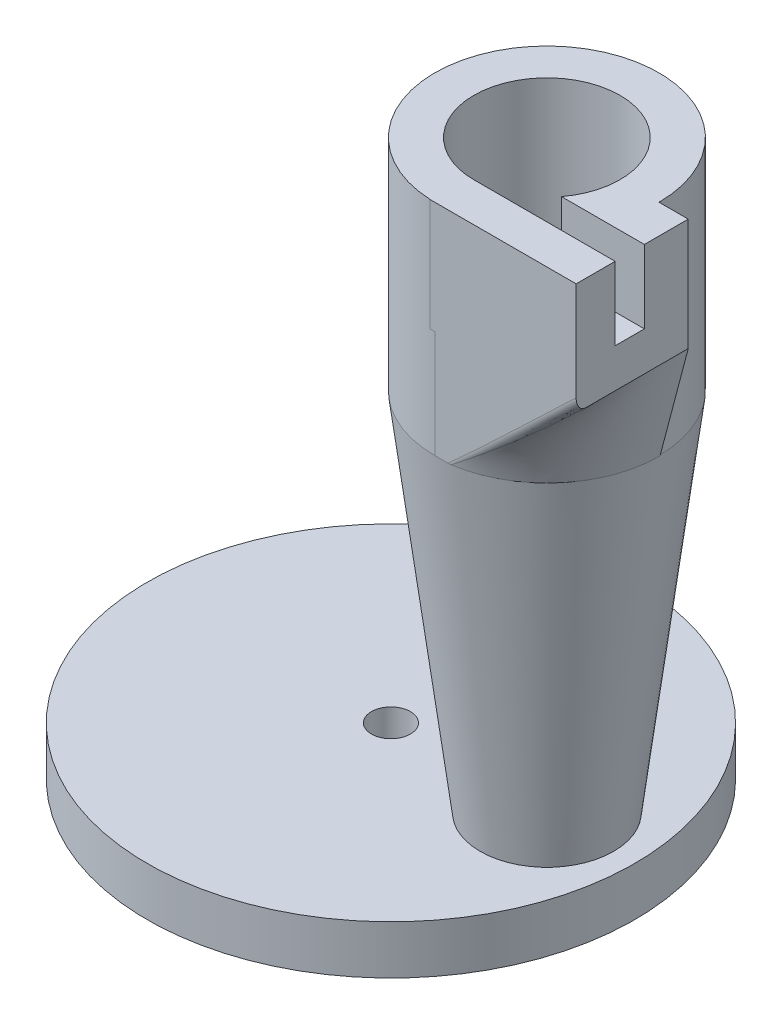
ISO-10303-21;
HEADER;
FILE_DESCRIPTION(('STEP AP214'),'2;1');
FILE_NAME('part.step','',(''),(''),'','','');
FILE_SCHEMA(('AUTOMOTIVE_DESIGN { 1 0 10303 214 1 1 1 1 }'));
ENDSEC;
DATA;
#1=APPLICATION_CONTEXT('core data for automotive mechanical design processes');
#2=APPLICATION_PROTOCOL_DEFINITION('international standard','automotive_design',2000,#1);
#3=PRODUCT_CONTEXT('',#1,'mechanical');
#4=PRODUCT('Part','Part','',(#3));
#5=PRODUCT_RELATED_PRODUCT_CATEGORY('part','',(#4));
#6=PRODUCT_DEFINITION_FORMATION('','',#4);
#7=PRODUCT_DEFINITION_CONTEXT('part definition',#1,'design');
#8=PRODUCT_DEFINITION('design','',#6,#7);
#9=PRODUCT_DEFINITION_SHAPE('','',#8);
#10=(LENGTH_UNIT() NAMED_UNIT(*) SI_UNIT(.MILLI.,.METRE.));
#11=(NAMED_UNIT(*) PLANE_ANGLE_UNIT() SI_UNIT($,.RADIAN.));
#12=(NAMED_UNIT(*) SI_UNIT($,.STERADIAN.) SOLID_ANGLE_UNIT());
#13=UNCERTAINTY_MEASURE_WITH_UNIT(LENGTH_MEASURE(1.E-05),#10,'distance_accuracy_value','');
#14=(GEOMETRIC_REPRESENTATION_CONTEXT(3) GLOBAL_UNCERTAINTY_ASSIGNED_CONTEXT((#13)) GLOBAL_UNIT_ASSIGNED_CONTEXT((#10,
#11,#12)) REPRESENTATION_CONTEXT('',''));
#15=CARTESIAN_POINT('',(0.,0.,0.));
#16=DIRECTION('',(0.,0.,1.));
#17=DIRECTION('',(1.,0.,0.));
#18=AXIS2_PLACEMENT_3D('',#15,#16,#17);
#19=CARTESIAN_POINT('',(0.,0.,0.));
#20=DIRECTION('',(0.,-1.,0.));
#21=DIRECTION('',(0.,0.,-1.));
#22=AXIS2_PLACEMENT_3D('',#19,#20,#21);
#23=CYLINDRICAL_SURFACE('',#22,11.5);
#24=CARTESIAN_POINT('',(0.,37.5,0.));
#25=DIRECTION('',(0.,-1.,0.));
#26=DIRECTION('',(0.,0.,-1.));
#27=AXIS2_PLACEMENT_3D('',#24,#25,#26);
#28=CIRCLE('',#27,11.5);
#29=CARTESIAN_POINT('',(0.,37.5,11.5));
#30=VERTEX_POINT('',#29);
#31=CARTESIAN_POINT('',(11.5,37.5,0.));
#32=VERTEX_POINT('',#31);
#33=EDGE_CURVE('E150',#30,#32,#28,.T.);
#34=ORIENTED_EDGE('',*,*,#33,.F.);
#35=DIRECTION('',(0.,-1.,0.));
#36=VECTOR('',#35,1.);
#37=CARTESIAN_POINT('',(0.,48.5,11.5));
#38=LINE('',#37,#36);
#39=CARTESIAN_POINT('',(0.,48.5,11.5));
#40=VERTEX_POINT('',#39);
#41=EDGE_CURVE('E145',#40,#30,#38,.T.);
#42=ORIENTED_EDGE('',*,*,#41,.F.);
#43=CARTESIAN_POINT('',(0.,48.5,0.));
#44=DIRECTION('',(0.,-1.,0.));
#45=DIRECTION('',(0.,0.,-1.));
#46=AXIS2_PLACEMENT_3D('',#43,#44,#45);
#47=CIRCLE('',#46,11.5);
#48=CARTESIAN_POINT('',(-0.499999999999999,48.5,11.489125293076));
#49=VERTEX_POINT('',#48);
#50=EDGE_CURVE('E147',#49,#40,#47,.F.);
#51=ORIENTED_EDGE('',*,*,#50,.F.);
#52=DIRECTION('',(0.,-1.,0.));
#53=VECTOR('',#52,1.);
#54=CARTESIAN_POINT('',(-0.499999999999999,0.,11.489125293076));
#55=LINE('',#54,#53);
#56=CARTESIAN_POINT('',(-0.499999999999999,60.,11.489125293076));
#57=VERTEX_POINT('',#56);
#58=EDGE_CURVE('E163',#57,#49,#55,.T.);
#59=ORIENTED_EDGE('',*,*,#58,.F.);
#60=CARTESIAN_POINT('',(0.,60.,0.));
#61=DIRECTION('',(0.,-1.,0.));
#62=DIRECTION('',(0.,0.,-1.));
#63=AXIS2_PLACEMENT_3D('',#60,#61,#62);
#64=CIRCLE('',#63,11.5);
#65=CARTESIAN_POINT('',(11.5,60.,0.));
#66=VERTEX_POINT('',#65);
#67=EDGE_CURVE('E283',#57,#66,#64,.T.);
#68=ORIENTED_EDGE('',*,*,#67,.T.);
#69=DIRECTION('',(0.,-1.,0.));
#70=VECTOR('',#69,1.);
#71=CARTESIAN_POINT('',(11.5,0.,0.));
#72=LINE('',#71,#70);
#73=EDGE_CURVE('E162',#32,#66,#72,.F.);
#74=ORIENTED_EDGE('',*,*,#73,.F.);
#75=EDGE_LOOP('',(#34,#42,#51,#59,#68,#74));
#76=FACE_BOUND('',#75,.T.);
#77=ADVANCED_FACE('F51',(#76),#23,.T.);
#78=CARTESIAN_POINT('',(0.,37.7472811272646,0.));
#79=DIRECTION('',(0.,1.,0.));
#80=DIRECTION('',(0.,0.,1.));
#81=AXIS2_PLACEMENT_3D('',#78,#79,#80);
#82=CONICAL_SURFACE('',#81,7.49999999999999,0.123483416160892);
#83=CARTESIAN_POINT('',(0.,0.,0.));
#84=DIRECTION('',(0.,-1.,0.));
#85=DIRECTION('',(0.,0.,-1.));
#86=AXIS2_PLACEMENT_3D('',#83,#84,#85);
#87=CIRCLE('',#86,2.815);
#88=CARTESIAN_POINT('',(0.,0.,-2.815));
#89=VERTEX_POINT('',#88);
#90=EDGE_CURVE('E291',#89,#89,#87,.T.);
#91=ORIENTED_EDGE('',*,*,#90,.T.);
#92=EDGE_LOOP('',(#91));
#93=FACE_BOUND('',#92,.T.);
#94=CARTESIAN_POINT('',(0.,37.7472811272646,0.));
#95=DIRECTION('',(0.,-1.,0.));
#96=DIRECTION('',(0.,0.,-1.));
#97=AXIS2_PLACEMENT_3D('',#94,#95,#96);
#98=CIRCLE('',#97,7.49999999999999);
#99=CARTESIAN_POINT('',(0.,37.7472811272646,-7.49999999999999));
#100=VERTEX_POINT('',#99);
#101=EDGE_CURVE('E288',#100,#100,#98,.T.);
#102=ORIENTED_EDGE('',*,*,#101,.F.);
#103=EDGE_LOOP('',(#102));
#104=FACE_BOUND('',#103,.T.);
#105=ADVANCED_FACE('F407',(#93,#104),#82,.F.);
#106=CARTESIAN_POINT('',(0.,0.,0.));
#107=DIRECTION('',(0.,-1.,0.));
#108=DIRECTION('',(0.,0.,-1.));
#109=AXIS2_PLACEMENT_3D('',#106,#107,#108);
#110=CYLINDRICAL_SURFACE('',#109,7.49999999999999);
#111=DIRECTION('',(0.,-1.,0.));
#112=VECTOR('',#111,1.);
#113=CARTESIAN_POINT('',(0.,60.,7.5));
#114=LINE('',#113,#112);
#115=CARTESIAN_POINT('',(0.,60.,7.49999999999999));
#116=VERTEX_POINT('',#115);
#117=CARTESIAN_POINT('',(0.,52.5,7.49999999999999));
#118=VERTEX_POINT('',#117);
#119=EDGE_CURVE('E246',#116,#118,#114,.T.);
#120=ORIENTED_EDGE('',*,*,#119,.T.);
#121=CARTESIAN_POINT('',(0.,52.5,0.));
#122=DIRECTION('',(0.,1.,0.));
#123=DIRECTION('',(0.,0.,1.));
#124=AXIS2_PLACEMENT_3D('',#121,#122,#123);
#125=CIRCLE('',#124,7.49999999999999);
#126=CARTESIAN_POINT('',(5.99999999999998,52.5,4.5));
#127=VERTEX_POINT('',#126);
#128=EDGE_CURVE('E241',#118,#127,#125,.T.);
#129=ORIENTED_EDGE('',*,*,#128,.T.);
#130=DIRECTION('',(0.,1.,0.));
#131=VECTOR('',#130,1.);
#132=CARTESIAN_POINT('',(5.99999999999998,41.,4.5));
#133=LINE('',#132,#131);
#134=CARTESIAN_POINT('',(5.99999999999999,60.,4.5));
#135=VERTEX_POINT('',#134);
#136=EDGE_CURVE('E243',#127,#135,#133,.T.);
#137=ORIENTED_EDGE('',*,*,#136,.T.);
#138=CARTESIAN_POINT('',(0.,60.,0.));
#139=DIRECTION('',(0.,-1.,0.));
#140=DIRECTION('',(0.,0.,-1.));
#141=AXIS2_PLACEMENT_3D('',#138,#139,#140);
#142=CIRCLE('',#141,7.49999999999999);
#143=EDGE_CURVE('E285',#116,#135,#142,.T.);
#144=ORIENTED_EDGE('',*,*,#143,.F.);
#145=EDGE_LOOP('',(#120,#129,#137,#144));
#146=FACE_BOUND('',#145,.T.);
#147=ORIENTED_EDGE('',*,*,#101,.T.);
#148=EDGE_LOOP('',(#147));
#149=FACE_BOUND('',#148,.T.);
#150=ADVANCED_FACE('F410',(#146,#149),#110,.F.);
#151=CARTESIAN_POINT('',(7.49999999999999,60.,0.));
#152=DIRECTION('',(0.,1.,0.));
#153=DIRECTION('',(0.,0.,1.));
#154=AXIS2_PLACEMENT_3D('',#151,#152,#153);
#155=PLANE('',#154);
#156=ORIENTED_EDGE('',*,*,#143,.T.);
#157=DIRECTION('',(1.,0.,0.));
#158=VECTOR('',#157,1.);
#159=CARTESIAN_POINT('',(-0.499999999999999,60.,4.5));
#160=LINE('',#159,#158);
#161=CARTESIAN_POINT('',(14.5,60.,4.5));
#162=VERTEX_POINT('',#161);
#163=EDGE_CURVE('E173',#135,#162,#160,.T.);
#164=ORIENTED_EDGE('',*,*,#163,.T.);
#165=DIRECTION('',(0.,0.,1.));
#166=VECTOR('',#165,1.);
#167=CARTESIAN_POINT('',(14.5,60.,4.5));
#168=LINE('',#167,#166);
#169=CARTESIAN_POINT('',(14.5,60.,0.));
#170=VERTEX_POINT('',#169);
#171=EDGE_CURVE('E258',#170,#162,#168,.T.);
#172=ORIENTED_EDGE('',*,*,#171,.F.);
#173=DIRECTION('',(1.,0.,0.));
#174=VECTOR('',#173,1.);
#175=CARTESIAN_POINT('',(-0.499999999999999,60.,0.));
#176=LINE('',#175,#174);
#177=EDGE_CURVE('E170',#66,#170,#176,.T.);
#178=ORIENTED_EDGE('',*,*,#177,.F.);
#179=ORIENTED_EDGE('',*,*,#67,.F.);
#180=DIRECTION('',(0.,0.,1.));
#181=VECTOR('',#180,1.);
#182=CARTESIAN_POINT('',(-0.499999999999999,60.,11.5));
#183=LINE('',#182,#181);
#184=CARTESIAN_POINT('',(-0.499999999999999,60.,11.5));
#185=VERTEX_POINT('',#184);
#186=EDGE_CURVE('E250',#57,#185,#183,.T.);
#187=ORIENTED_EDGE('',*,*,#186,.T.);
#188=DIRECTION('',(1.,0.,0.));
#189=VECTOR('',#188,1.);
#190=CARTESIAN_POINT('',(-0.499999999999999,60.,11.5));
#191=LINE('',#190,#189);
#192=CARTESIAN_POINT('',(14.5,60.,11.5));
#193=VERTEX_POINT('',#192);
#194=EDGE_CURVE('E171',#185,#193,#191,.T.);
#195=ORIENTED_EDGE('',*,*,#194,.T.);
#196=DIRECTION('',(0.,0.,1.));
#197=VECTOR('',#196,1.);
#198=CARTESIAN_POINT('',(14.5,60.,11.5));
#199=LINE('',#198,#197);
#200=CARTESIAN_POINT('',(14.5,60.,7.5));
#201=VERTEX_POINT('',#200);
#202=EDGE_CURVE('E249',#201,#193,#199,.T.);
#203=ORIENTED_EDGE('',*,*,#202,.F.);
#204=DIRECTION('',(1.,0.,0.));
#205=VECTOR('',#204,1.);
#206=CARTESIAN_POINT('',(-0.499999999999999,60.,7.5));
#207=LINE('',#206,#205);
#208=EDGE_CURVE('E270',#116,#201,#207,.T.);
#209=ORIENTED_EDGE('',*,*,#208,.F.);
#210=EDGE_LOOP('',(#156,#164,#172,#178,#179,#187,#195,#203,#209));
#211=FACE_BOUND('',#210,.T.);
#212=ADVANCED_FACE('F315',(#211),#155,.T.);
#213=CARTESIAN_POINT('',(0.,0.,0.));
#214=DIRECTION('',(0.,1.,0.));
#215=DIRECTION('',(0.,0.,1.));
#216=AXIS2_PLACEMENT_3D('',#213,#214,#215);
#217=CONICAL_SURFACE('',#216,6.84569127223571,0.123483416160892);
#218=CARTESIAN_POINT('',(0.,37.5,0.));
#219=DIRECTION('',(0.,-1.,0.));
#220=DIRECTION('',(1.,0.,0.));
#221=AXIS2_PLACEMENT_3D('',#218,#219,#220);
#222=CIRCLE('',#221,11.5);
#223=CARTESIAN_POINT('',(0.0238940979477491,37.5,11.4999875801416));
#224=VERTEX_POINT('',#223);
#225=EDGE_CURVE('E286',#32,#224,#222,.T.);
#226=ORIENTED_EDGE('',*,*,#225,.T.);
#227=CARTESIAN_POINT('',(0.,37.5,0.));
#228=DIRECTION('',(0.,-1.,0.));
#229=DIRECTION('',(0.,0.,-1.));
#230=AXIS2_PLACEMENT_3D('',#227,#228,#229);
#231=CIRCLE('',#230,11.5);
#232=EDGE_CURVE('E153',#224,#30,#231,.T.);
#233=ORIENTED_EDGE('',*,*,#232,.T.);
#234=ORIENTED_EDGE('',*,*,#33,.T.);
#235=EDGE_LOOP('',(#226,#233,#234));
#236=FACE_BOUND('',#235,.T.);
#237=CARTESIAN_POINT('',(0.,0.,0.));
#238=DIRECTION('',(0.,-1.,0.));
#239=DIRECTION('',(0.,0.,-1.));
#240=AXIS2_PLACEMENT_3D('',#237,#238,#239);
#241=CIRCLE('',#240,6.84569127223571);
#242=CARTESIAN_POINT('',(0.,0.,-6.84569127223571));
#243=VERTEX_POINT('',#242);
#244=EDGE_CURVE('E280',#243,#243,#241,.T.);
#245=ORIENTED_EDGE('',*,*,#244,.F.);
#246=EDGE_LOOP('',(#245));
#247=FACE_BOUND('',#246,.T.);
#248=ADVANCED_FACE('F304',(#236,#247),#217,.T.);
#249=CARTESIAN_POINT('',(6.84569127223571,0.,0.));
#250=DIRECTION('',(0.,1.,0.));
#251=DIRECTION('',(0.,0.,1.));
#252=AXIS2_PLACEMENT_3D('',#249,#250,#251);
#253=PLANE('',#252);
#254=ORIENTED_EDGE('',*,*,#244,.T.);
#255=EDGE_LOOP('',(#254));
#256=FACE_BOUND('',#255,.T.);
#257=CARTESIAN_POINT('',(-16.,0.,0.));
#258=DIRECTION('',(0.,-1.,0.));
#259=DIRECTION('',(0.,0.,-1.));
#260=AXIS2_PLACEMENT_3D('',#257,#258,#259);
#261=CIRCLE('',#260,2.);
#262=CARTESIAN_POINT('',(-16.,0.,-2.));
#263=VERTEX_POINT('',#262);
#264=EDGE_CURVE('E604',#263,#263,#261,.T.);
#265=ORIENTED_EDGE('',*,*,#264,.T.);
#266=EDGE_LOOP('',(#265));
#267=FACE_BOUND('',#266,.T.);
#268=CARTESIAN_POINT('',(-16.,0.,0.));
#269=DIRECTION('',(0.,-1.,0.));
#270=DIRECTION('',(0.,0.,-1.));
#271=AXIS2_PLACEMENT_3D('',#268,#269,#270);
#272=CIRCLE('',#271,25.);
#273=CARTESIAN_POINT('',(-16.,0.,-25.));
#274=VERTEX_POINT('',#273);
#275=EDGE_CURVE('E607',#274,#274,#272,.T.);
#276=ORIENTED_EDGE('',*,*,#275,.F.);
#277=EDGE_LOOP('',(#276));
#278=FACE_BOUND('',#277,.T.);
#279=ADVANCED_FACE('F314',(#256,#267,#278),#253,.T.);
#280=CARTESIAN_POINT('',(2.815,-5.,0.));
#281=DIRECTION('',(0.,-1.,0.));
#282=DIRECTION('',(0.,0.,-1.));
#283=AXIS2_PLACEMENT_3D('',#280,#281,#282);
#284=PLANE('',#283);
#285=CARTESIAN_POINT('',(0.,-5.,0.));
#286=DIRECTION('',(0.,-1.,0.));
#287=DIRECTION('',(0.,0.,-1.));
#288=AXIS2_PLACEMENT_3D('',#285,#286,#287);
#289=CIRCLE('',#288,2.815);
#290=CARTESIAN_POINT('',(0.,-5.,-2.815));
#291=VERTEX_POINT('',#290);
#292=EDGE_CURVE('E272',#291,#291,#289,.T.);
#293=ORIENTED_EDGE('',*,*,#292,.F.);
#294=EDGE_LOOP('',(#293));
#295=FACE_BOUND('',#294,.T.);
#296=CARTESIAN_POINT('',(-16.,-5.,0.));
#297=DIRECTION('',(0.,-1.,0.));
#298=DIRECTION('',(0.,0.,-1.));
#299=AXIS2_PLACEMENT_3D('',#296,#297,#298);
#300=CIRCLE('',#299,2.);
#301=CARTESIAN_POINT('',(-16.,-5.,-2.));
#302=VERTEX_POINT('',#301);
#303=EDGE_CURVE('E614',#302,#302,#300,.T.);
#304=ORIENTED_EDGE('',*,*,#303,.F.);
#305=EDGE_LOOP('',(#304));
#306=FACE_BOUND('',#305,.T.);
#307=CARTESIAN_POINT('',(-16.,-5.,0.));
#308=DIRECTION('',(0.,-1.,0.));
#309=DIRECTION('',(0.,0.,-1.));
#310=AXIS2_PLACEMENT_3D('',#307,#308,#309);
#311=CIRCLE('',#310,25.);
#312=CARTESIAN_POINT('',(-16.,-5.,-25.));
#313=VERTEX_POINT('',#312);
#314=EDGE_CURVE('E608',#313,#313,#311,.T.);
#315=ORIENTED_EDGE('',*,*,#314,.T.);
#316=EDGE_LOOP('',(#315));
#317=FACE_BOUND('',#316,.T.);
#318=ADVANCED_FACE('F515',(#295,#306,#317),#284,.T.);
#319=CARTESIAN_POINT('',(0.,0.,0.));
#320=DIRECTION('',(0.,-1.,0.));
#321=DIRECTION('',(0.,0.,-1.));
#322=AXIS2_PLACEMENT_3D('',#319,#320,#321);
#323=CYLINDRICAL_SURFACE('',#322,2.815);
#324=ORIENTED_EDGE('',*,*,#292,.T.);
#325=EDGE_LOOP('',(#324));
#326=FACE_BOUND('',#325,.T.);
#327=ORIENTED_EDGE('',*,*,#90,.F.);
#328=EDGE_LOOP('',(#327));
#329=FACE_BOUND('',#328,.T.);
#330=ADVANCED_FACE('F354',(#326,#329),#323,.F.);
#331=CARTESIAN_POINT('',(14.5,0.,0.));
#332=DIRECTION('',(-1.,0.,0.));
#333=DIRECTION('',(0.,0.,1.));
#334=AXIS2_PLACEMENT_3D('',#331,#332,#333);
#335=PLANE('',#334);
#336=DIRECTION('',(0.,-1.,0.));
#337=VECTOR('',#336,1.);
#338=CARTESIAN_POINT('',(14.5,60.,11.5));
#339=LINE('',#338,#337);
#340=CARTESIAN_POINT('',(14.5,49.8741831116433,11.5));
#341=VERTEX_POINT('',#340);
#342=EDGE_CURVE('E257',#193,#341,#339,.T.);
#343=ORIENTED_EDGE('',*,*,#342,.T.);
#344=CARTESIAN_POINT('',(18.3270982272595,53.4324744484125,11.5));
#345=CARTESIAN_POINT('',(19.2174719535008,52.4637158000148,11.5));
#346=CARTESIAN_POINT('',(18.9790860664938,52.7230882218279,10.2322631160588));
#347=CARTESIAN_POINT('',(17.9485732377409,53.0845864068516,11.5));
#348=CARTESIAN_POINT('',(18.8287535822594,52.1370380926104,11.5));
#349=CARTESIAN_POINT('',(18.6043319630364,52.3726392818946,10.248329326022));
#350=CARTESIAN_POINT('',(17.5706243942171,52.736071141079,11.5));
#351=CARTESIAN_POINT('',(18.4363937672007,51.8074147302744,11.5));
#352=CARTESIAN_POINT('',(18.2301751372626,52.0216168215836,10.2656755683862));
#353=CARTESIAN_POINT('',(16.8159215193194,52.0377582818663,11.5));
#354=CARTESIAN_POINT('',(17.6502991872931,51.1471037188842,11.5));
#355=CARTESIAN_POINT('',(17.4827644081412,51.3187007565604,10.3033676775976));
#356=CARTESIAN_POINT('',(16.4391674739088,51.687960703596,11.5));
#357=CARTESIAN_POINT('',(17.2577291042656,50.8173922635779,11.5));
#358=CARTESIAN_POINT('',(17.1095104941983,50.9668071621695,10.3237135090706));
#359=CARTESIAN_POINT('',(15.6868876221408,50.9870469839543,11.5));
#360=CARTESIAN_POINT('',(16.4712703883977,50.1568208382619,11.5));
#361=CARTESIAN_POINT('',(16.3636049686257,50.2624162936681,10.3678447239822));
#362=CARTESIAN_POINT('',(15.3113618163198,50.6359308420072,11.5));
#363=CARTESIAN_POINT('',(16.0785849767215,49.8269725337902,11.5));
#364=CARTESIAN_POINT('',(15.9909533572589,49.909919019294,10.3916301089229));
#365=CARTESIAN_POINT('',(14.5614972869269,49.9324243411901,11.5));
#366=CARTESIAN_POINT('',(15.2919795915709,49.1659792341524,11.5));
#367=CARTESIAN_POINT('',(15.2456376194724,49.2048655085766,10.4429379510206));
#368=CARTESIAN_POINT('',(14.1871585774064,49.5800339673419,11.5));
#369=CARTESIAN_POINT('',(14.8992009099565,48.8358003251393,11.5));
#370=CARTESIAN_POINT('',(14.8729734929569,48.8523092715872,10.4704604522457));
#371=CARTESIAN_POINT('',(13.8133971829128,49.2270327162744,11.5));
#372=CARTESIAN_POINT('',(14.5000000028737,48.5000000017409,11.5));
#373=CARTESIAN_POINT('',(14.500000002388,48.5000000022552,10.4999999998099));
#374=CARTESIAN_POINT('',(13.6737306043982,49.0951328761242,11.5));
#375=CARTESIAN_POINT('',(14.353850889853,48.377057633239,11.5));
#376=CARTESIAN_POINT('',(14.3606165215545,48.3683679764672,10.5110240001007));
#377=CARTESIAN_POINT('',(13.5341412736851,48.9631512770181,11.5));
#378=CARTESIAN_POINT('',(14.2069203686341,48.2534258639735,11.5));
#379=CARTESIAN_POINT('',(14.2211789753236,48.2367801599068,10.5223186212777));
#380=CARTESIAN_POINT('',(13.255109460256,48.6990342718918,11.5));
#381=CARTESIAN_POINT('',(13.9130175820364,48.0060492456747,11.5));
#382=CARTESIAN_POINT('',(13.9421445237087,47.9737399924448,10.54544281812));
#383=CARTESIAN_POINT('',(13.1156669768406,48.5668988666104,11.5));
#384=CARTESIAN_POINT('',(13.7660937423688,47.8823460186685,11.5));
#385=CARTESIAN_POINT('',(13.8025476190904,47.8422876408981,10.5572723912256));
#386=CARTESIAN_POINT('',(12.5335587309871,48.0147179446237,11.5));
#387=CARTESIAN_POINT('',(13.1597522603929,47.3716496891484,11.5));
#388=CARTESIAN_POINT('',(13.219063961376,47.29364162619,10.6077840807635));
#389=CARTESIAN_POINT('',(12.0915196175837,47.5940117156206,11.5));
#390=CARTESIAN_POINT('',(12.6934331597229,46.9784587728197,11.5));
#391=CARTESIAN_POINT('',(12.7742139443098,46.8772718296425,10.6488696859057));
#392=CARTESIAN_POINT('',(11.2083947498972,46.7515993557183,11.5));
#393=CARTESIAN_POINT('',(11.7598515275345,46.1900825816809,11.5));
#394=CARTESIAN_POINT('',(11.8804537495736,46.0481155993419,10.7353284794654));
#395=CARTESIAN_POINT('',(10.7673089973432,46.3298932230085,11.5));
#396=CARTESIAN_POINT('',(11.2933404232107,45.7955737519943,11.5));
#397=CARTESIAN_POINT('',(11.4315435645473,45.6353291720837,10.7807016756525));
#398=CARTESIAN_POINT('',(9.88545475237936,45.486142918253,11.5));
#399=CARTESIAN_POINT('',(10.3602630454294,45.0053022819841,11.5));
#400=CARTESIAN_POINT('',(10.5277997099772,44.8151242770154,10.8735412964738));
#401=CARTESIAN_POINT('',(9.44468626244665,45.0640987436212,11.5));
#402=CARTESIAN_POINT('',(9.89356605965432,44.6094697226544,11.5));
#403=CARTESIAN_POINT('',(10.0729659947012,44.4077058506975,10.9210077372755));
#404=CARTESIAN_POINT('',(8.56270491077817,44.2204753854143,11.5));
#405=CARTESIAN_POINT('',(8.96101710909828,43.8176405762782,11.5));
#406=CARTESIAN_POINT('',(9.15616902949068,43.5995797954773,11.0148747843121));
#407=CARTESIAN_POINT('',(8.12149204963126,43.7988962012247,11.5));
#408=CARTESIAN_POINT('',(8.49410361338759,43.4207699694703,11.5));
#409=CARTESIAN_POINT('',(8.69420578899248,43.1988721576945,11.0612753919575));
#410=CARTESIAN_POINT('',(7.37664451867989,43.0892692357515,11.5));
#411=CARTESIAN_POINT('',(7.70504484644918,42.7498011198065,11.5));
#412=CARTESIAN_POINT('',(7.90939377250021,42.5293130075853,11.1356755776042));
#413=CARTESIAN_POINT('',(7.0733351262827,42.800880255591,11.5));
#414=CARTESIAN_POINT('',(7.38509801912298,42.4776632539201,11.5));
#415=CARTESIAN_POINT('',(7.58843568381249,42.2585865976086,11.164876393315));
#416=CARTESIAN_POINT('',(6.46591385716449,42.2249488333212,11.5));
#417=CARTESIAN_POINT('',(6.74590085313783,41.9340064965397,11.5));
#418=CARTESIAN_POINT('',(6.94352676777599,41.7202520257326,11.2201618499068));
#419=CARTESIAN_POINT('',(6.16180198118371,41.9374063904316,11.5));
#420=CARTESIAN_POINT('',(6.42593409520581,41.6618778409765,11.5));
#421=CARTESIAN_POINT('',(6.6195759431871,41.4526438609582,11.2462464936611));
#422=CARTESIAN_POINT('',(5.55259474096442,41.3633710057339,11.5));
#423=CARTESIAN_POINT('',(5.78674806062582,41.1184213193046,11.5));
#424=CARTESIAN_POINT('',(5.96926731351504,40.9201092012276,11.2945695543227));
#425=CARTESIAN_POINT('',(5.24749938675842,41.0768780532831,11.5));
#426=CARTESIAN_POINT('',(5.4667456444207,40.8464253747716,11.5));
#427=CARTESIAN_POINT('',(5.6429095329419,40.6551826790293,11.3168080103395));
#428=CARTESIAN_POINT('',(4.6361959969529,40.5050820915786,11.5));
#429=CARTESIAN_POINT('',(4.82750770570709,40.3033291159992,11.5));
#430=CARTESIAN_POINT('',(4.98852135829338,40.1273772881502,11.3570650334445));
#431=CARTESIAN_POINT('',(4.3299879621724,40.2197790814493,11.5));
#432=CARTESIAN_POINT('',(4.50748081630961,40.0315538095041,11.5));
#433=CARTESIAN_POINT('',(4.66049096544912,39.8644984179625,11.3750836036383));
#434=CARTESIAN_POINT('',(3.6117156457527,39.5533235262208,11.5));
#435=CARTESIAN_POINT('',(3.76022614711992,39.3972715103461,11.5));
#436=CARTESIAN_POINT('',(3.8914630984269,39.2505970218283,11.4123063675243));
#437=CARTESIAN_POINT('',(3.19917919964927,39.1726794786149,11.5));
#438=CARTESIAN_POINT('',(3.33066500054193,39.0328841598022,11.5));
#439=CARTESIAN_POINT('',(3.45010759755949,38.9001018234377,11.4298176322799));
#440=CARTESIAN_POINT('',(2.5787798293171,38.6034444088422,11.5));
#441=CARTESIAN_POINT('',(2.68640527454811,38.4866586676605,11.5));
#442=CARTESIAN_POINT('',(2.78805898271722,38.3749003149558,11.4510162622407));
#443=CARTESIAN_POINT('',(2.37171207484723,38.4139859072229,11.5));
#444=CARTESIAN_POINT('',(2.4719618740775,38.3048933196422,11.5));
#445=CARTESIAN_POINT('',(2.56737123507352,38.1999215273516,11.4572377997176));
#446=CARTESIAN_POINT('',(1.95706419325688,38.0356303989013,11.5));
#447=CARTESIAN_POINT('',(2.04323901407566,37.9415766421885,11.5));
#448=CARTESIAN_POINT('',(2.12612961492012,37.8499850657346,11.4681733575765));
#449=CARTESIAN_POINT('',(1.7494840661255,37.8467333922111,11.5));
#450=CARTESIAN_POINT('',(1.82879230902504,37.7598833736586,11.5));
#451=CARTESIAN_POINT('',(1.90557574241327,37.6750273917222,11.4728873779263));
#452=CARTESIAN_POINT('',(1.54165664215917,37.658108708473,11.5));
#453=CARTESIAN_POINT('',(1.61424407236263,37.5781321729464,11.5));
#454=CARTESIAN_POINT('',(1.68515753861513,37.5000000040962,11.4769386523983));
#455=CARTESIAN_POINT('',(1.32160362141298,37.4583850702252,11.5));
#456=CARTESIAN_POINT('',(1.38750974755392,37.3860581322469,11.5));
#457=CARTESIAN_POINT('',(1.45176053642619,37.3146860331439,11.4812286889971));
#458=CARTESIAN_POINT('',(1.10127384762593,37.2589668104027,11.5));
#459=CARTESIAN_POINT('',(1.16049825571542,37.1937802441257,11.5));
#460=CARTESIAN_POINT('',(1.21851613506386,37.1292934012025,11.4847782395444));
#461=CARTESIAN_POINT('',(0.66009568606511,36.8607050129652,11.5));
#462=CARTESIAN_POINT('',(0.70662522829856,36.8093941023395,11.5));
#463=CARTESIAN_POINT('',(0.752397350908737,36.7582546201424,11.4906229532754));
#464=CARTESIAN_POINT('',(0.439247298589943,36.6618614750195,11.5));
#465=CARTESIAN_POINT('',(0.479619658018664,36.6171638027133,11.5));
#466=CARTESIAN_POINT('',(0.519522967903034,36.5726084711696,11.4929181171812));
#467=CARTESIAN_POINT('',(-0.243545379667377,36.0486050894537,11.5));
#468=CARTESIAN_POINT('',(-0.220822991258621,36.0240591641345,11.5));
#469=CARTESIAN_POINT('',(-0.198991187757134,35.998737743079,11.4984191914109));
#470=CARTESIAN_POINT('',(-0.70630298687488,35.6350971154914,11.5));
#471=CARTESIAN_POINT('',(-0.695086615594047,35.6225243790514,11.4999999999999));
#472=CARTESIAN_POINT('',(-0.683900674833865,35.6099251171122,11.4998978955063));
#473=CARTESIAN_POINT('',(-1.18624592398008,35.2080781218649,11.5));
#474=CARTESIAN_POINT('',(-1.18553674248696,35.2072806816501,11.5));
#475=CARTESIAN_POINT('',(-1.18482733230893,35.206483472996,11.4999982688376));
#476=CARTESIAN_POINT('',(-1.20254986809987,35.1935742351721,11.5));
#477=CARTESIAN_POINT('',(-1.20219593751093,35.1931760294733,11.5));
#478=CARTESIAN_POINT('',(-1.20184173242901,35.1927780966059,11.4999999699422));
#479=CARTESIAN_POINT('',(-1.21885489581604,35.1790715697716,11.5));
#480=CARTESIAN_POINT('',(-1.21885489581604,35.1790715697716,11.5));
#481=CARTESIAN_POINT('',(-1.21885489581734,35.1790715697616,11.5));
#482=(BOUNDED_SURFACE() B_SPLINE_SURFACE(3,2,((#344,#345,#346),(#347,#348,#349),(#350,#351,
#352),(#353,#354,#355),(#356,#357,#358),(#359,#360,#361),(#362,#363,#364),(#365,#366,#367),
(#368,#369,#370),(#371,#372,#373),(#374,#375,#376),(#377,#378,#379),(#380,#381,#382),(#383,#384,
#385),(#386,#387,#388),(#389,#390,#391),(#392,#393,#394),(#395,#396,#397),(#398,#399,#400),
(#401,#402,#403),(#404,#405,#406),(#407,#408,#409),(#410,#411,#412),(#413,#414,#415),(#416,#417,
#418),(#419,#420,#421),(#422,#423,#424),(#425,#426,#427),(#428,#429,#430),(#431,#432,#433),
(#434,#435,#436),(#437,#438,#439),(#440,#441,#442),(#443,#444,#445),(#446,#447,#448),(#449,#450,
#451),(#452,#453,#454),(#455,#456,#457),(#458,#459,#460),(#461,#462,#463),(#464,#465,#466),
(#467,#468,#469),(#470,#471,#472),(#473,#474,#475),(#476,#477,#478),(#479,#480,#481)),
.UNSPECIFIED.,.F.,.F.,.F.) B_SPLINE_SURFACE_WITH_KNOTS((4,2,2,2,3,2,2,2,2,2,2,2,2,2,2,2,2,3,2,2,
2,4),(3,3),(0.,1.54232430366937,3.08463042012848,4.62693721014515,6.16926218869366,
6.74557703409276,7.32188912229001,9.15260487774271,10.9833239507526,12.8140571660982,
14.6447879585813,15.9003675243842,17.1559459324137,18.4115115724906,19.6670762885436,
21.3510157111007,22.1930030900874,23.0349904869745,23.9265140771489,24.8180371541428,
26.6798018632652,26.7452666007468),(0.,1.),
.UNSPECIFIED.) GEOMETRIC_REPRESENTATION_ITEM() RATIONAL_B_SPLINE_SURFACE(((1.,0.605088058078654,
1.),(1.,0.611721858316845,1.),(1.,0.618783484443874,1.),(1.,0.63383107955852,1.),(1.,
0.64181703764523,1.),(1.,0.658782144675186,1.),(1.,0.667761294052177,1.),(1.,0.686700982991269,
1.),(1.,0.696661534125724,1.),(1.,0.707106781119328,1.),(1.,0.711004262357841,1.),(1.,
0.71496530412546,1.),(1.,0.723005988841426,1.),(1.,0.72708563122227,1.),(1.,0.744354646510324,
1.),(1.,0.758044554222607,1.),(1.,0.786040341554804,1.),(1.,0.800346222290915,1.),(1.,
0.828838534348845,1.),(1.,0.843024964747061,1.),(1.,0.870416753429098,1.),(1.,0.883622113011283,
1.),(1.,0.904383789168844,1.),(1.,0.912411473460615,1.),(1.,0.927435868907959,1.),(1.,
0.934432581014189,1.),(1.,0.947273041015835,1.),(1.,0.953116800634999,1.),(1.,0.963618195076255,
1.),(1.,0.968275830771263,1.),(1.,0.977846521274128,1.),(1.,0.982304550870365,1.),(1.,
0.987679631434713,1.),(1.,0.989252673938936,1.),(1.,0.992012365701833,1.),(1.,0.993199014952294,
1.),(1.,0.99421794700267,1.),(1.,0.995296457760616,1.),(1.,0.996187507618104,1.),(1.,
0.99765330669489,1.),(1.,0.998228056096257,1.),(1.,0.99960515915253,1.),(1.,0.999974486479388,
1.),(1.,0.999999566765393,1.),(1.,0.999999992013914,1.),(1.,1.,1.))) REPRESENTATION_ITEM('') SURFACE());
#483=CARTESIAN_POINT('',(14.5,49.8741831116433,11.5));
#484=CARTESIAN_POINT('',(14.5,49.8321469977499,11.4999951784257));
#485=CARTESIAN_POINT('',(14.5,49.7901250901346,11.4985934217812));
#486=CARTESIAN_POINT('',(14.5,49.7062535876665,11.4929667901973));
#487=CARTESIAN_POINT('',(14.5,49.6644040717401,11.4887407414621));
#488=CARTESIAN_POINT('',(14.5,49.5388359775679,11.4717098296506));
#489=CARTESIAN_POINT('',(14.5,49.4556538169973,11.4545512659098));
#490=CARTESIAN_POINT('',(14.5,49.2961556405591,11.4091723554356));
#491=CARTESIAN_POINT('',(14.5,49.2196980176397,11.3814501666099));
#492=CARTESIAN_POINT('',(14.5,49.0721772194974,11.3143098691001));
#493=CARTESIAN_POINT('',(14.5,49.0011006437483,11.2749221009649));
#494=CARTESIAN_POINT('',(14.5,48.8851586750336,11.1957961360376));
#495=CARTESIAN_POINT('',(14.5,48.8383414516413,11.1589219536486));
#496=CARTESIAN_POINT('',(14.5,48.7510404348553,11.0782591115672));
#497=CARTESIAN_POINT('',(14.5,48.7105498530936,11.0344779657426));
#498=CARTESIAN_POINT('',(14.5,48.645542542005,10.9497800597474));
#499=CARTESIAN_POINT('',(14.5,48.6194514252581,10.9100768207831));
#500=CARTESIAN_POINT('',(14.5,48.5741573141641,10.8269740523501));
#501=CARTESIAN_POINT('',(14.5,48.5549386112346,10.7835832366278));
#502=CARTESIAN_POINT('',(14.5,48.5268443963474,10.7005155721973));
#503=CARTESIAN_POINT('',(14.5,48.516872566421,10.6612136602548));
#504=CARTESIAN_POINT('',(14.5,48.5067993004118,10.6013458923974));
#505=CARTESIAN_POINT('',(14.5,48.5042553990106,10.5811701994244));
#506=CARTESIAN_POINT('',(14.5,48.500853836566,10.5406660706093));
#507=CARTESIAN_POINT('',(14.5,48.4999971192865,10.5203375556608));
#508=CARTESIAN_POINT('',(14.5,48.5,10.5));
#509=B_SPLINE_CURVE_WITH_KNOTS('',3,(#483,#484,#485,#486,#487,#488,#489,#490,#491,#492,#493,
#494,#495,#496,#497,#498,#499,#500,#501,#502,#503,#504,#505,#506,#507,#508),.UNSPECIFIED.,.F.,
.F.,(4,2,2,2,2,2,2,2,2,2,2,2,4),(0.,0.126055688431547,0.252163799109594,0.50603441530343,
0.749175579702634,0.991689839437742,1.16987906561511,1.34787576533612,1.48984898860051,
1.63149559116087,1.75258476181469,1.81352803325952,1.87450538500787),.UNSPECIFIED.);
#510=CARTESIAN_POINT('',(14.5,48.5,10.5));
#511=VERTEX_POINT('',#510);
#512=EDGE_CURVE('E12',#341,#511,#509,.T.);
#513=ORIENTED_EDGE('',*,*,#512,.T.);
#514=DIRECTION('',(0.,0.,1.));
#515=VECTOR('',#514,1.);
#516=CARTESIAN_POINT('',(14.5,48.5,0.));
#517=LINE('',#516,#515);
#518=CARTESIAN_POINT('',(14.5,48.5,0.));
#519=VERTEX_POINT('',#518);
#520=EDGE_CURVE('E336',#511,#519,#517,.F.);
#521=ORIENTED_EDGE('',*,*,#520,.T.);
#522=DIRECTION('',(0.,1.,0.));
#523=VECTOR('',#522,1.);
#524=CARTESIAN_POINT('',(14.5,48.5,0.));
#525=LINE('',#524,#523);
#526=EDGE_CURVE('E262',#519,#170,#525,.T.);
#527=ORIENTED_EDGE('',*,*,#526,.T.);
#528=ORIENTED_EDGE('',*,*,#171,.T.);
#529=DIRECTION('',(0.,-1.,0.));
#530=VECTOR('',#529,1.);
#531=CARTESIAN_POINT('',(14.5,52.5,4.5));
#532=LINE('',#531,#530);
#533=CARTESIAN_POINT('',(14.5,52.5,4.5));
#534=VERTEX_POINT('',#533);
#535=EDGE_CURVE('E261',#162,#534,#532,.T.);
#536=ORIENTED_EDGE('',*,*,#535,.T.);
#537=DIRECTION('',(0.,0.,1.));
#538=VECTOR('',#537,1.);
#539=CARTESIAN_POINT('',(14.5,52.5,7.5));
#540=LINE('',#539,#538);
#541=CARTESIAN_POINT('',(14.5,52.5,7.5));
#542=VERTEX_POINT('',#541);
#543=EDGE_CURVE('E265',#534,#542,#540,.T.);
#544=ORIENTED_EDGE('',*,*,#543,.T.);
#545=DIRECTION('',(0.,1.,0.));
#546=VECTOR('',#545,1.);
#547=CARTESIAN_POINT('',(14.5,60.,7.5));
#548=LINE('',#547,#546);
#549=EDGE_CURVE('E252',#542,#201,#548,.T.);
#550=ORIENTED_EDGE('',*,*,#549,.T.);
#551=ORIENTED_EDGE('',*,*,#202,.T.);
#552=EDGE_LOOP('',(#343,#513,#521,#527,#528,#536,#544,#550,#551));
#553=FACE_BOUND('',#552,.T.);
#554=ADVANCED_FACE('F568',(#553),#335,.F.);
#555=CARTESIAN_POINT('',(-0.499999999999999,0.,0.));
#556=DIRECTION('',(-1.,0.,0.));
#557=DIRECTION('',(0.,0.,1.));
#558=AXIS2_PLACEMENT_3D('',#555,#556,#557);
#559=PLANE('',#558);
#560=ORIENTED_EDGE('',*,*,#186,.F.);
#561=ORIENTED_EDGE('',*,*,#58,.T.);
#562=DIRECTION('',(0.,0.,-1.));
#563=VECTOR('',#562,1.);
#564=CARTESIAN_POINT('',(-0.499999999999999,48.5,11.5));
#565=LINE('',#564,#563);
#566=CARTESIAN_POINT('',(-0.499999999999999,48.5,11.5));
#567=VERTEX_POINT('',#566);
#568=EDGE_CURVE('E161',#567,#49,#565,.T.);
#569=ORIENTED_EDGE('',*,*,#568,.F.);
#570=DIRECTION('',(0.,-1.,0.));
#571=VECTOR('',#570,1.);
#572=CARTESIAN_POINT('',(-0.499999999999999,60.,11.5));
#573=LINE('',#572,#571);
#574=EDGE_CURVE('E169',#185,#567,#573,.T.);
#575=ORIENTED_EDGE('',*,*,#574,.F.);
#576=EDGE_LOOP('',(#560,#561,#569,#575));
#577=FACE_BOUND('',#576,.T.);
#578=ADVANCED_FACE('F218',(#577),#559,.T.);
#579=CARTESIAN_POINT('',(-0.499999999999999,48.5,0.));
#580=DIRECTION('',(0.,0.,-1.));
#581=DIRECTION('',(-1.,0.,0.));
#582=AXIS2_PLACEMENT_3D('',#579,#580,#581);
#583=PLANE('',#582);
#584=ORIENTED_EDGE('',*,*,#526,.F.);
#585=DIRECTION('',(0.25492596930508,0.966960573226161,0.));
#586=VECTOR('',#585,1.);
#587=CARTESIAN_POINT('',(13.05,43.,0.));
#588=LINE('',#587,#586);
#589=CARTESIAN_POINT('',(11.6,37.5,0.));
#590=VERTEX_POINT('',#589);
#591=EDGE_CURVE('E154',#590,#519,#588,.T.);
#592=ORIENTED_EDGE('',*,*,#591,.F.);
#593=DIRECTION('',(-1.,0.,0.));
#594=VECTOR('',#593,1.);
#595=CARTESIAN_POINT('',(11.6,37.5,0.));
#596=LINE('',#595,#594);
#597=EDGE_CURVE('E194',#590,#32,#596,.T.);
#598=ORIENTED_EDGE('',*,*,#597,.T.);
#599=ORIENTED_EDGE('',*,*,#73,.T.);
#600=ORIENTED_EDGE('',*,*,#177,.T.);
#601=EDGE_LOOP('',(#584,#592,#598,#599,#600));
#602=FACE_BOUND('',#601,.T.);
#603=ADVANCED_FACE('F453',(#602),#583,.T.);
#604=CARTESIAN_POINT('',(-0.499999999999999,60.,7.5));
#605=DIRECTION('',(0.,0.,-1.));
#606=DIRECTION('',(0.,1.,0.));
#607=AXIS2_PLACEMENT_3D('',#604,#605,#606);
#608=PLANE('',#607);
#609=DIRECTION('',(1.,0.,0.));
#610=VECTOR('',#609,1.);
#611=CARTESIAN_POINT('',(-0.499999999999999,52.5,7.5));
#612=LINE('',#611,#610);
#613=EDGE_CURVE('E273',#118,#542,#612,.T.);
#614=ORIENTED_EDGE('',*,*,#613,.F.);
#615=ORIENTED_EDGE('',*,*,#119,.F.);
#616=ORIENTED_EDGE('',*,*,#208,.T.);
#617=ORIENTED_EDGE('',*,*,#549,.F.);
#618=EDGE_LOOP('',(#614,#615,#616,#617));
#619=FACE_BOUND('',#618,.T.);
#620=ADVANCED_FACE('F352',(#619),#608,.T.);
#621=CARTESIAN_POINT('',(-0.499999999999999,60.,11.5));
#622=DIRECTION('',(0.,0.,1.));
#623=DIRECTION('',(0.,-1.,0.));
#624=AXIS2_PLACEMENT_3D('',#621,#622,#623);
#625=PLANE('',#624);
#626=DIRECTION('',(1.,0.,0.));
#627=VECTOR('',#626,1.);
#628=CARTESIAN_POINT('',(0.,37.5,11.5));
#629=LINE('',#628,#627);
#630=CARTESIAN_POINT('',(1.36732619433963,37.5,11.5));
#631=VERTEX_POINT('',#630);
#632=EDGE_CURVE('E55',#224,#631,#629,.T.);
#633=ORIENTED_EDGE('',*,*,#632,.T.);
#634=CARTESIAN_POINT('',(-1.21885489581604,35.1790715697716,11.5));
#635=CARTESIAN_POINT('',(-1.20254986809987,35.1935742351721,11.5));
#636=CARTESIAN_POINT('',(-1.18624592398008,35.2080781218649,11.5));
#637=CARTESIAN_POINT('',(-0.706302986874878,35.6350971154914,11.5));
#638=CARTESIAN_POINT('',(-0.243545379667376,36.0486050894537,11.5));
#639=CARTESIAN_POINT('',(0.439247298589943,36.6618614750196,11.5));
#640=CARTESIAN_POINT('',(0.66009568606511,36.8607050129652,11.5));
#641=CARTESIAN_POINT('',(1.10127384762593,37.2589668104027,11.5));
#642=CARTESIAN_POINT('',(1.32160362141298,37.4583850702252,11.5));
#643=CARTESIAN_POINT('',(1.54165664215917,37.658108708473,11.5));
#644=CARTESIAN_POINT('',(1.7494840661255,37.8467333922111,11.5));
#645=CARTESIAN_POINT('',(1.95706419325688,38.0356303989013,11.5));
#646=CARTESIAN_POINT('',(2.37171207484723,38.4139859072229,11.5));
#647=CARTESIAN_POINT('',(2.5787798293171,38.6034444088422,11.5));
#648=CARTESIAN_POINT('',(3.19917919964927,39.1726794786149,11.5));
#649=CARTESIAN_POINT('',(3.6117156457527,39.5533235262208,11.5));
#650=CARTESIAN_POINT('',(4.3299879621724,40.2197790814493,11.5));
#651=CARTESIAN_POINT('',(4.6361959969529,40.5050820915786,11.5));
#652=CARTESIAN_POINT('',(5.24749938675842,41.0768780532831,11.5));
#653=CARTESIAN_POINT('',(5.55259474096441,41.3633710057339,11.5));
#654=CARTESIAN_POINT('',(6.16180198118371,41.9374063904316,11.5));
#655=CARTESIAN_POINT('',(6.46591385716449,42.2249488333212,11.5));
#656=CARTESIAN_POINT('',(7.0733351262827,42.800880255591,11.5));
#657=CARTESIAN_POINT('',(7.37664451867989,43.0892692357515,11.5));
#658=CARTESIAN_POINT('',(8.12149204963126,43.7988962012247,11.5));
#659=CARTESIAN_POINT('',(8.56270491077817,44.2204753854143,11.5));
#660=CARTESIAN_POINT('',(9.44468626244665,45.0640987436212,11.5));
#661=CARTESIAN_POINT('',(9.88545475237936,45.486142918253,11.5));
#662=CARTESIAN_POINT('',(10.7673089973432,46.3298932230085,11.5));
#663=CARTESIAN_POINT('',(11.2083947498972,46.7515993557183,11.5));
#664=CARTESIAN_POINT('',(12.0915196175837,47.5940117156206,11.5));
#665=CARTESIAN_POINT('',(12.5335587309871,48.0147179446237,11.5));
#666=CARTESIAN_POINT('',(13.1156669768406,48.5668988666104,11.5));
#667=CARTESIAN_POINT('',(13.255109460256,48.6990342718918,11.5));
#668=CARTESIAN_POINT('',(13.5341412736851,48.9631512770181,11.5));
#669=CARTESIAN_POINT('',(13.6737306043982,49.0951328761242,11.5));
#670=CARTESIAN_POINT('',(13.8133971829128,49.2270327162744,11.5));
#671=CARTESIAN_POINT('',(14.1871585774064,49.5800339673419,11.5));
#672=CARTESIAN_POINT('',(14.5614972869269,49.9324243411901,11.5));
#673=CARTESIAN_POINT('',(15.3113618163198,50.6359308420072,11.5));
#674=CARTESIAN_POINT('',(15.6868876221408,50.9870469839543,11.5));
#675=CARTESIAN_POINT('',(16.4391674739088,51.687960703596,11.5));
#676=CARTESIAN_POINT('',(16.8159215193194,52.0377582818663,11.5));
#677=CARTESIAN_POINT('',(17.5706243942171,52.736071141079,11.5));
#678=CARTESIAN_POINT('',(17.9485732377409,53.0845864068516,11.5));
#679=CARTESIAN_POINT('',(18.3270982272595,53.4324744484125,11.5));
#680=B_SPLINE_CURVE_WITH_KNOTS('',3,(#634,#635,#636,#637,#638,#639,#640,#641,#642,#643,#644,
#645,#646,#647,#648,#649,#650,#651,#652,#653,#654,#655,#656,#657,#658,#659,#660,#661,#662,#663,
#664,#665,#666,#667,#668,#669,#670,#671,#672,#673,#674,#675,#676,#677,#678,#679),.UNSPECIFIED.,
.F.,.F.,(4,2,2,2,3,2,2,2,2,2,2,2,2,2,2,2,2,3,2,2,2,4),(0.,0.0654647374816082,1.927229446604,
2.81875252359786,3.71027611377226,4.55226351065936,5.39425088964609,7.0781903122032,
8.33375502825617,9.58932066833306,10.8448990763626,12.1004786421655,13.9312094346486,
15.7619426499942,17.5926617230041,19.4233774784568,19.999689566654,20.5760044120531,
22.1183293906016,23.6606361806183,25.2029422970774,26.7452666007468),.UNSPECIFIED.);
#681=EDGE_CURVE('E61',#631,#341,#680,.T.);
#682=ORIENTED_EDGE('',*,*,#681,.T.);
#683=ORIENTED_EDGE('',*,*,#342,.F.);
#684=ORIENTED_EDGE('',*,*,#194,.F.);
#685=ORIENTED_EDGE('',*,*,#574,.T.);
#686=DIRECTION('',(1.,0.,0.));
#687=VECTOR('',#686,1.);
#688=CARTESIAN_POINT('',(-0.499999999999999,48.5,11.5));
#689=LINE('',#688,#687);
#690=EDGE_CURVE('E159',#567,#40,#689,.T.);
#691=ORIENTED_EDGE('',*,*,#690,.T.);
#692=ORIENTED_EDGE('',*,*,#41,.T.);
#693=ORIENTED_EDGE('',*,*,#232,.F.);
#694=EDGE_LOOP('',(#633,#682,#683,#684,#685,#691,#692,#693));
#695=FACE_BOUND('',#694,.T.);
#696=ADVANCED_FACE('F166',(#695),#625,.T.);
#697=CARTESIAN_POINT('',(-0.499999999999999,48.5,11.5));
#698=DIRECTION('',(0.,-1.,0.));
#699=DIRECTION('',(0.,0.,-1.));
#700=AXIS2_PLACEMENT_3D('',#697,#698,#699);
#701=PLANE('',#700);
#702=ORIENTED_EDGE('',*,*,#568,.T.);
#703=ORIENTED_EDGE('',*,*,#50,.T.);
#704=ORIENTED_EDGE('',*,*,#690,.F.);
#705=EDGE_LOOP('',(#702,#703,#704));
#706=FACE_BOUND('',#705,.T.);
#707=ADVANCED_FACE('F158',(#706),#701,.T.);
#708=CARTESIAN_POINT('',(-0.499999999999999,52.5,7.5));
#709=DIRECTION('',(0.,1.,0.));
#710=DIRECTION('',(0.,0.,1.));
#711=AXIS2_PLACEMENT_3D('',#708,#709,#710);
#712=PLANE('',#711);
#713=ORIENTED_EDGE('',*,*,#128,.F.);
#714=ORIENTED_EDGE('',*,*,#613,.T.);
#715=ORIENTED_EDGE('',*,*,#543,.F.);
#716=DIRECTION('',(1.,0.,0.));
#717=VECTOR('',#716,1.);
#718=CARTESIAN_POINT('',(-0.499999999999999,52.5,4.5));
#719=LINE('',#718,#717);
#720=EDGE_CURVE('E275',#127,#534,#719,.T.);
#721=ORIENTED_EDGE('',*,*,#720,.F.);
#722=EDGE_LOOP('',(#713,#714,#715,#721));
#723=FACE_BOUND('',#722,.T.);
#724=ADVANCED_FACE('F463',(#723),#712,.T.);
#725=CARTESIAN_POINT('',(-0.499999999999999,52.5,4.5));
#726=DIRECTION('',(0.,0.,1.));
#727=DIRECTION('',(0.,-1.,0.));
#728=AXIS2_PLACEMENT_3D('',#725,#726,#727);
#729=PLANE('',#728);
#730=ORIENTED_EDGE('',*,*,#136,.F.);
#731=ORIENTED_EDGE('',*,*,#720,.T.);
#732=ORIENTED_EDGE('',*,*,#535,.F.);
#733=ORIENTED_EDGE('',*,*,#163,.F.);
#734=EDGE_LOOP('',(#730,#731,#732,#733));
#735=FACE_BOUND('',#734,.T.);
#736=ADVANCED_FACE('F213',(#735),#729,.T.);
#737=CARTESIAN_POINT('',(0.,37.5,0.));
#738=DIRECTION('',(0.,-1.,0.));
#739=DIRECTION('',(0.,0.,-1.));
#740=AXIS2_PLACEMENT_3D('',#737,#738,#739);
#741=PLANE('',#740);
#742=CARTESIAN_POINT('',(0.,37.5,0.));
#743=DIRECTION('',(0.,1.,0.));
#744=DIRECTION('',(0.,0.,-1.));
#745=AXIS2_PLACEMENT_3D('',#742,#743,#744);
#746=CIRCLE('',#745,11.6);
#747=CARTESIAN_POINT('',(1.68515855634195,37.5,11.4769456328493));
#748=VERTEX_POINT('',#747);
#749=EDGE_CURVE('E328',#748,#590,#746,.T.);
#750=ORIENTED_EDGE('',*,*,#749,.F.);
#751=CARTESIAN_POINT('',(1.68515753428265,37.5,11.4769386523718));
#752=CARTESIAN_POINT('',(1.63246557011033,37.5,11.4846405334638));
#753=CARTESIAN_POINT('',(1.57963362901176,37.5,11.490413252975));
#754=CARTESIAN_POINT('',(1.473689848736,37.5,11.4981003647886));
#755=CARTESIAN_POINT('',(1.42057800985356,37.5,11.5000147611536));
#756=CARTESIAN_POINT('',(1.36732619433963,37.5,11.5));
#757=B_SPLINE_CURVE_WITH_KNOTS('',3,(#751,#752,#753,#754,#755,#756),.UNSPECIFIED.,.F.,.F.,(4,2,
4),(0.,0.159439156474096,0.318878145075521),.UNSPECIFIED.);
#758=EDGE_CURVE('E76',#748,#631,#757,.T.);
#759=ORIENTED_EDGE('',*,*,#758,.T.);
#760=ORIENTED_EDGE('',*,*,#632,.F.);
#761=ORIENTED_EDGE('',*,*,#225,.F.);
#762=ORIENTED_EDGE('',*,*,#597,.F.);
#763=EDGE_LOOP('',(#750,#759,#760,#761,#762));
#764=FACE_BOUND('',#763,.T.);
#765=ADVANCED_FACE('F202',(#764),#741,.T.);
#766=CARTESIAN_POINT('',(14.5,48.5,0.));
#767=CARTESIAN_POINT('',(11.6,37.5,0.));
#768=CARTESIAN_POINT('',(14.5,48.5,0.479166666666667));
#769=CARTESIAN_POINT('',(11.6,37.5,0.637185451761897));
#770=CARTESIAN_POINT('',(14.5,48.5,0.958333333333333));
#771=CARTESIAN_POINT('',(11.5472171670899,37.5,1.2944861178965));
#772=CARTESIAN_POINT('',(14.5,48.5,1.91666666666667));
#773=CARTESIAN_POINT('',(11.3197098798901,37.5,2.62261069327536));
#774=CARTESIAN_POINT('',(14.5,48.5,2.39583333333333));
#775=CARTESIAN_POINT('',(11.1448432389409,37.5,3.29332676548478));
#776=CARTESIAN_POINT('',(14.5,48.5,3.35416666666667));
#777=CARTESIAN_POINT('',(10.6659463684133,37.5,4.61423017099889));
#778=CARTESIAN_POINT('',(14.5,48.5,3.83333333333333));
#779=CARTESIAN_POINT('',(10.3618394066162,37.5,5.2642307237388));
#780=CARTESIAN_POINT('',(14.5,48.5,4.79166666666667));
#781=CARTESIAN_POINT('',(9.63020648877816,37.5,6.50683978477681));
#782=CARTESIAN_POINT('',(14.5,48.5,5.27083333333333));
#783=CARTESIAN_POINT('',(9.20271531880798,37.5,7.09923308077073));
#784=CARTESIAN_POINT('',(14.5,48.5,6.22916666666667));
#785=CARTESIAN_POINT('',(8.24380144633117,37.5,8.19321776151474));
#786=CARTESIAN_POINT('',(14.5,48.5,6.70833333333333));
#787=CARTESIAN_POINT('',(7.71252622418906,37.5,8.69464089209297));
#788=CARTESIAN_POINT('',(14.5,48.5,7.66666666666667));
#789=CARTESIAN_POINT('',(6.57649015190634,37.5,9.58277716964859));
#790=CARTESIAN_POINT('',(14.5,48.5,8.14583333333333));
#791=CARTESIAN_POINT('',(5.97193810101121,37.5,9.96942763264348));
#792=CARTESIAN_POINT('',(14.5,48.5,9.10416666666666));
#793=CARTESIAN_POINT('',(4.72516836517638,37.5,10.6172649927164));
#794=CARTESIAN_POINT('',(14.5,48.5,9.58333333333333));
#795=CARTESIAN_POINT('',(4.08314590432034,37.5,10.8785034879525));
#796=CARTESIAN_POINT('',(14.5,48.5,10.5416666666667));
#797=CARTESIAN_POINT('',(2.79627939770152,37.5,11.2780645566229));
#798=CARTESIAN_POINT('',(14.5,48.5,11.0208333333333));
#799=CARTESIAN_POINT('',(2.15156088908644,37.5,11.4165139618226));
#800=CARTESIAN_POINT('',(14.5,48.5,11.5));
#801=CARTESIAN_POINT('',(1.51986841535698,37.5,11.5));
#802=B_SPLINE_SURFACE_WITH_KNOTS('',3,1,((#766,#767),(#768,#769),(#770,#771),(#772,#773),(#774,
#775),(#776,#777),(#778,#779),(#780,#781),(#782,#783),(#784,#785),(#786,#787),(#788,#789),(#790,
#791),(#792,#793),(#794,#795),(#796,#797),(#798,#799),(#800,#801)),.UNSPECIFIED.,.F.,.F.,.F.,(4,
2,2,2,2,2,2,2,4),(2,2),(0.,0.125,0.25,0.375,0.5,0.625,0.75,0.875,1.),(0.,1.),.UNSPECIFIED.);
#803=CARTESIAN_POINT('',(18.9790860664938,52.7230882218279,10.2322631160588));
#804=CARTESIAN_POINT('',(18.6043319630364,52.3726392818946,10.248329326022));
#805=CARTESIAN_POINT('',(18.2301751372626,52.0216168215836,10.2656755683862));
#806=CARTESIAN_POINT('',(17.4827644081412,51.3187007565604,10.3033676775976));
#807=CARTESIAN_POINT('',(17.1095104941983,50.9668071621695,10.3237135090706));
#808=CARTESIAN_POINT('',(16.3636049686257,50.2624162936681,10.3678447239822));
#809=CARTESIAN_POINT('',(15.9909533572589,49.909919019294,10.3916301089229));
#810=CARTESIAN_POINT('',(15.2456376194724,49.2048655085766,10.4429379510206));
#811=CARTESIAN_POINT('',(14.8729734929569,48.8523092715872,10.4704604522457));
#812=CARTESIAN_POINT('',(14.500000002388,48.5000000022552,10.4999999998099));
#813=CARTESIAN_POINT('',(14.3606165215545,48.3683679764672,10.5110240001007));
#814=CARTESIAN_POINT('',(14.2211789753236,48.2367801599068,10.5223186212777));
#815=CARTESIAN_POINT('',(13.9421445237087,47.9737399924448,10.54544281812));
#816=CARTESIAN_POINT('',(13.8025476190904,47.8422876408981,10.5572723912256));
#817=CARTESIAN_POINT('',(13.219063961376,47.29364162619,10.6077840807635));
#818=CARTESIAN_POINT('',(12.7742139443098,46.8772718296425,10.6488696859057));
#819=CARTESIAN_POINT('',(11.8804537495736,46.0481155993419,10.7353284794654));
#820=CARTESIAN_POINT('',(11.4315435645473,45.6353291720837,10.7807016756525));
#821=CARTESIAN_POINT('',(10.5277997099772,44.8151242770154,10.8735412964738));
#822=CARTESIAN_POINT('',(10.0729659947012,44.4077058506975,10.9210077372755));
#823=CARTESIAN_POINT('',(9.15616902949068,43.5995797954773,11.0148747843121));
#824=CARTESIAN_POINT('',(8.69420578899248,43.1988721576945,11.0612753919575));
#825=CARTESIAN_POINT('',(7.90939377250021,42.5293130075853,11.1356755776042));
#826=CARTESIAN_POINT('',(7.58843568381249,42.2585865976086,11.164876393315));
#827=CARTESIAN_POINT('',(6.94352676777599,41.7202520257326,11.2201618499068));
#828=CARTESIAN_POINT('',(6.6195759431871,41.4526438609582,11.2462464936611));
#829=CARTESIAN_POINT('',(5.96926731351504,40.9201092012276,11.2945695543227));
#830=CARTESIAN_POINT('',(5.6429095329419,40.6551826790293,11.3168080103395));
#831=CARTESIAN_POINT('',(4.98852135829338,40.1273772881502,11.3570650334445));
#832=CARTESIAN_POINT('',(4.66049096544912,39.8644984179625,11.3750836036383));
#833=CARTESIAN_POINT('',(3.89146309842689,39.2505970218283,11.4123063675243));
#834=CARTESIAN_POINT('',(3.45010759755949,38.9001018234377,11.4298176322799));
#835=CARTESIAN_POINT('',(2.78805898271722,38.3749003149558,11.4510162622407));
#836=CARTESIAN_POINT('',(2.56737123507352,38.1999215273516,11.4572377997176));
#837=CARTESIAN_POINT('',(2.12612961492012,37.8499850657346,11.4681733575765));
#838=CARTESIAN_POINT('',(1.90557574241327,37.6750273917222,11.4728873779263));
#839=CARTESIAN_POINT('',(1.68515753861513,37.5000000040962,11.4769386523983));
#840=CARTESIAN_POINT('',(1.45176053642619,37.3146860331439,11.4812286889971));
#841=CARTESIAN_POINT('',(1.21851613506386,37.1292934012026,11.4847782395444));
#842=CARTESIAN_POINT('',(0.752397350908737,36.7582546201424,11.4906229532754));
#843=CARTESIAN_POINT('',(0.519522967903034,36.5726084711696,11.4929181171812));
#844=CARTESIAN_POINT('',(-0.198991187757133,35.998737743079,11.4984191914109));
#845=CARTESIAN_POINT('',(-0.683900674833861,35.6099251171123,11.4998978955063));
#846=CARTESIAN_POINT('',(-1.18482733230893,35.206483472996,11.4999982688376));
#847=CARTESIAN_POINT('',(-1.20184173242901,35.1927780966059,11.4999999699422));
#848=CARTESIAN_POINT('',(-1.21885489581734,35.1790715697616,11.5));
#849=B_SPLINE_CURVE_WITH_KNOTS('',3,(#803,#804,#805,#806,#807,#808,#809,#810,#811,#812,#813,
#814,#815,#816,#817,#818,#819,#820,#821,#822,#823,#824,#825,#826,#827,#828,#829,#830,#831,#832,
#833,#834,#835,#836,#837,#838,#839,#840,#841,#842,#843,#844,#845,#846,#847,#848),.UNSPECIFIED.,
.F.,.F.,(4,2,2,2,3,2,2,2,2,2,2,2,2,2,2,2,2,3,2,2,2,4),(0.,1.54232430366937,3.08463042012848,
4.62693721014515,6.16926218869366,6.74557703409276,7.32188912229001,9.15260487774271,
10.9833239507526,12.8140571660982,14.6447879585813,15.9003675243842,17.1559459324137,
18.4115115724906,19.6670762885436,21.3510157111007,22.1930030900874,23.0349904869745,
23.9265140771489,24.8180371541428,26.6798018632652,26.7452666007468),.UNSPECIFIED.);
#850=EDGE_CURVE('E331',#511,#748,#849,.T.);
#851=ORIENTED_EDGE('',*,*,#520,.F.);
#852=ORIENTED_EDGE('',*,*,#850,.T.);
#853=ORIENTED_EDGE('',*,*,#749,.T.);
#854=ORIENTED_EDGE('',*,*,#591,.T.);
#855=EDGE_LOOP('',(#851,#852,#853,#854));
#856=FACE_BOUND('',#855,.T.);
#857=ADVANCED_FACE('F212',(#856),#802,.T.);
#858=ORIENTED_EDGE('',*,*,#512,.F.);
#859=ORIENTED_EDGE('',*,*,#681,.F.);
#860=ORIENTED_EDGE('',*,*,#758,.F.);
#861=ORIENTED_EDGE('',*,*,#850,.F.);
#862=EDGE_LOOP('',(#858,#859,#860,#861));
#863=FACE_BOUND('',#862,.T.);
#864=ADVANCED_FACE('F363',(#863),#482,.T.);
#865=CARTESIAN_POINT('',(-16.,0.,0.));
#866=DIRECTION('',(0.,-1.,0.));
#867=DIRECTION('',(0.,0.,-1.));
#868=AXIS2_PLACEMENT_3D('',#865,#866,#867);
#869=CYLINDRICAL_SURFACE('',#868,25.);
#870=ORIENTED_EDGE('',*,*,#275,.T.);
#871=EDGE_LOOP('',(#870));
#872=FACE_BOUND('',#871,.T.);
#873=ORIENTED_EDGE('',*,*,#314,.F.);
#874=EDGE_LOOP('',(#873));
#875=FACE_BOUND('',#874,.T.);
#876=ADVANCED_FACE('F368',(#872,#875),#869,.T.);
#877=CARTESIAN_POINT('',(-16.,0.,0.));
#878=DIRECTION('',(0.,-1.,0.));
#879=DIRECTION('',(0.,0.,-1.));
#880=AXIS2_PLACEMENT_3D('',#877,#878,#879);
#881=CYLINDRICAL_SURFACE('',#880,2.);
#882=ORIENTED_EDGE('',*,*,#264,.F.);
#883=EDGE_LOOP('',(#882));
#884=FACE_BOUND('',#883,.T.);
#885=ORIENTED_EDGE('',*,*,#303,.T.);
#886=EDGE_LOOP('',(#885));
#887=FACE_BOUND('',#886,.T.);
#888=ADVANCED_FACE('F499',(#884,#887),#881,.F.);
#889=CLOSED_SHELL('',(#77,#105,#150,#212,#248,#279,#318,#330,#554,#578,#603,#620,#696,#707,#724,
#736,#765,#857,#864,#876,#888));
#890=MANIFOLD_SOLID_BREP('B2',#889);
#891=ADVANCED_BREP_SHAPE_REPRESENTATION('',(#18,#890),#14);
#892=SHAPE_DEFINITION_REPRESENTATION(#9,#891);
ENDSEC;
END-ISO-10303-21;
